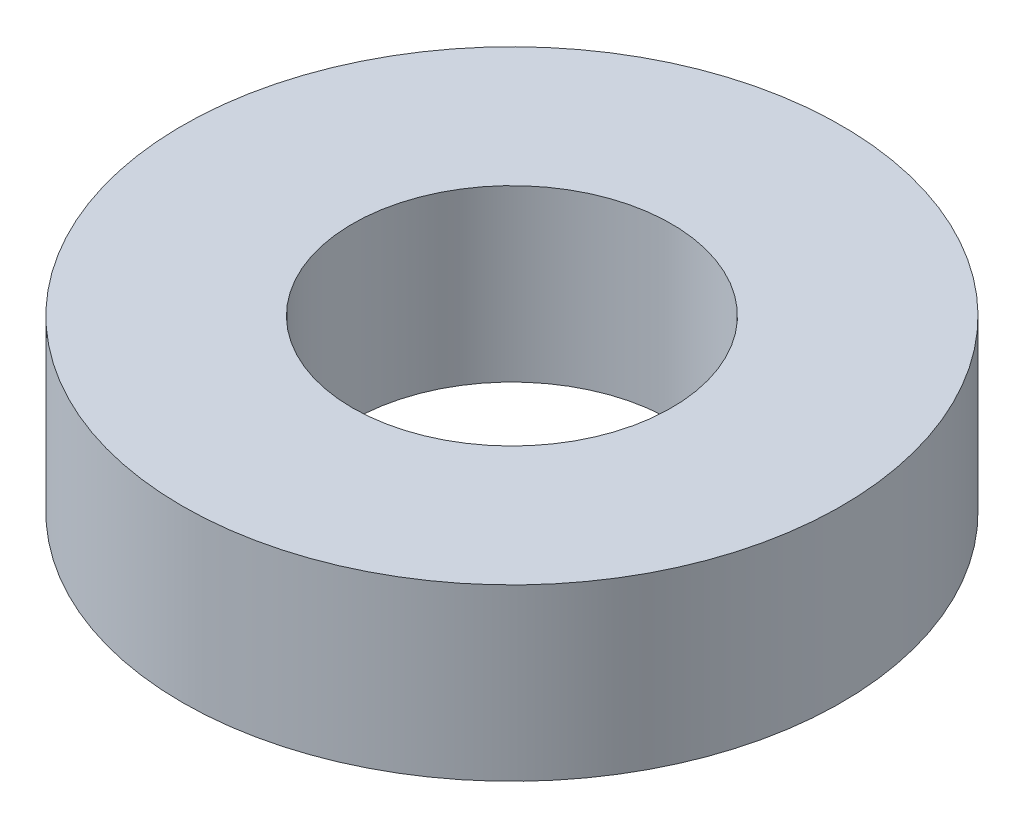
ISO-10303-21;
HEADER;
FILE_DESCRIPTION(('STEP AP214'),'2;1');
FILE_NAME('part.step','',(''),(''),'','','');
FILE_SCHEMA(('AUTOMOTIVE_DESIGN { 1 0 10303 214 1 1 1 1 }'));
ENDSEC;
DATA;
#1=APPLICATION_CONTEXT('core data for automotive mechanical design processes');
#2=APPLICATION_PROTOCOL_DEFINITION('international standard','automotive_design',2000,#1);
#3=PRODUCT_CONTEXT('',#1,'mechanical');
#4=PRODUCT('Part','Part','',(#3));
#5=PRODUCT_RELATED_PRODUCT_CATEGORY('part','',(#4));
#6=PRODUCT_DEFINITION_FORMATION('','',#4);
#7=PRODUCT_DEFINITION_CONTEXT('part definition',#1,'design');
#8=PRODUCT_DEFINITION('design','',#6,#7);
#9=PRODUCT_DEFINITION_SHAPE('','',#8);
#10=(LENGTH_UNIT() NAMED_UNIT(*) SI_UNIT(.MILLI.,.METRE.));
#11=(NAMED_UNIT(*) PLANE_ANGLE_UNIT() SI_UNIT($,.RADIAN.));
#12=(NAMED_UNIT(*) SI_UNIT($,.STERADIAN.) SOLID_ANGLE_UNIT());
#13=UNCERTAINTY_MEASURE_WITH_UNIT(LENGTH_MEASURE(1.E-05),#10,'distance_accuracy_value','');
#14=(GEOMETRIC_REPRESENTATION_CONTEXT(3) GLOBAL_UNCERTAINTY_ASSIGNED_CONTEXT((#13)) GLOBAL_UNIT_ASSIGNED_CONTEXT((#10,
#11,#12)) REPRESENTATION_CONTEXT('',''));
#15=CARTESIAN_POINT('',(0.,0.,0.));
#16=DIRECTION('',(0.,0.,1.));
#17=DIRECTION('',(1.,0.,0.));
#18=AXIS2_PLACEMENT_3D('',#15,#16,#17);
#19=CARTESIAN_POINT('',(0.,16.,0.));
#20=DIRECTION('',(0.,1.,0.));
#21=DIRECTION('',(0.,0.,1.));
#22=AXIS2_PLACEMENT_3D('',#19,#20,#21);
#23=PLANE('',#22);
#24=CARTESIAN_POINT('',(0.,16.,0.));
#25=DIRECTION('',(0.,1.,0.));
#26=DIRECTION('',(0.,0.,1.));
#27=AXIS2_PLACEMENT_3D('',#24,#25,#26);
#28=CIRCLE('',#27,31.);
#29=CARTESIAN_POINT('',(0.,16.,31.));
#30=VERTEX_POINT('',#29);
#31=EDGE_CURVE('E10',#30,#30,#28,.T.);
#32=ORIENTED_EDGE('',*,*,#31,.T.);
#33=EDGE_LOOP('',(#32));
#34=FACE_BOUND('',#33,.T.);
#35=CARTESIAN_POINT('',(0.,16.,0.));
#36=DIRECTION('',(0.,1.,0.));
#37=DIRECTION('',(0.,0.,1.));
#38=AXIS2_PLACEMENT_3D('',#35,#36,#37);
#39=CIRCLE('',#38,15.);
#40=CARTESIAN_POINT('',(0.,16.,15.));
#41=VERTEX_POINT('',#40);
#42=EDGE_CURVE('E41',#41,#41,#39,.T.);
#43=ORIENTED_EDGE('',*,*,#42,.F.);
#44=EDGE_LOOP('',(#43));
#45=FACE_BOUND('',#44,.T.);
#46=ADVANCED_FACE('F30',(#34,#45),#23,.T.);
#47=CARTESIAN_POINT('',(0.,0.,0.));
#48=DIRECTION('',(0.,1.,0.));
#49=DIRECTION('',(0.,0.,1.));
#50=AXIS2_PLACEMENT_3D('',#47,#48,#49);
#51=PLANE('',#50);
#52=CARTESIAN_POINT('',(0.,0.,0.));
#53=DIRECTION('',(0.,1.,0.));
#54=DIRECTION('',(0.,0.,1.));
#55=AXIS2_PLACEMENT_3D('',#52,#53,#54);
#56=CIRCLE('',#55,31.);
#57=CARTESIAN_POINT('',(0.,0.,31.));
#58=VERTEX_POINT('',#57);
#59=EDGE_CURVE('E34',#58,#58,#56,.T.);
#60=ORIENTED_EDGE('',*,*,#59,.F.);
#61=EDGE_LOOP('',(#60));
#62=FACE_BOUND('',#61,.T.);
#63=CARTESIAN_POINT('',(0.,0.,0.));
#64=DIRECTION('',(0.,1.,0.));
#65=DIRECTION('',(0.,0.,1.));
#66=AXIS2_PLACEMENT_3D('',#63,#64,#65);
#67=CIRCLE('',#66,15.);
#68=CARTESIAN_POINT('',(0.,0.,15.));
#69=VERTEX_POINT('',#68);
#70=EDGE_CURVE('E43',#69,#69,#67,.T.);
#71=ORIENTED_EDGE('',*,*,#70,.T.);
#72=EDGE_LOOP('',(#71));
#73=FACE_BOUND('',#72,.T.);
#74=ADVANCED_FACE('F53',(#62,#73),#51,.F.);
#75=CARTESIAN_POINT('',(0.,16.,0.));
#76=DIRECTION('',(0.,-1.,0.));
#77=DIRECTION('',(0.,0.,-1.));
#78=AXIS2_PLACEMENT_3D('',#75,#76,#77);
#79=CYLINDRICAL_SURFACE('',#78,31.);
#80=ORIENTED_EDGE('',*,*,#31,.F.);
#81=EDGE_LOOP('',(#80));
#82=FACE_BOUND('',#81,.T.);
#83=ORIENTED_EDGE('',*,*,#59,.T.);
#84=EDGE_LOOP('',(#83));
#85=FACE_BOUND('',#84,.T.);
#86=ADVANCED_FACE('F32',(#82,#85),#79,.T.);
#87=CARTESIAN_POINT('',(0.,16.,0.));
#88=DIRECTION('',(0.,-1.,0.));
#89=DIRECTION('',(0.,0.,-1.));
#90=AXIS2_PLACEMENT_3D('',#87,#88,#89);
#91=CYLINDRICAL_SURFACE('',#90,15.);
#92=ORIENTED_EDGE('',*,*,#42,.T.);
#93=EDGE_LOOP('',(#92));
#94=FACE_BOUND('',#93,.T.);
#95=ORIENTED_EDGE('',*,*,#70,.F.);
#96=EDGE_LOOP('',(#95));
#97=FACE_BOUND('',#96,.T.);
#98=ADVANCED_FACE('F49',(#94,#97),#91,.F.);
#99=CLOSED_SHELL('',(#46,#74,#86,#98));
#100=MANIFOLD_SOLID_BREP('B2',#99);
#101=ADVANCED_BREP_SHAPE_REPRESENTATION('',(#18,#100),#14);
#102=SHAPE_DEFINITION_REPRESENTATION(#9,#101);
ENDSEC;
END-ISO-10303-21;
